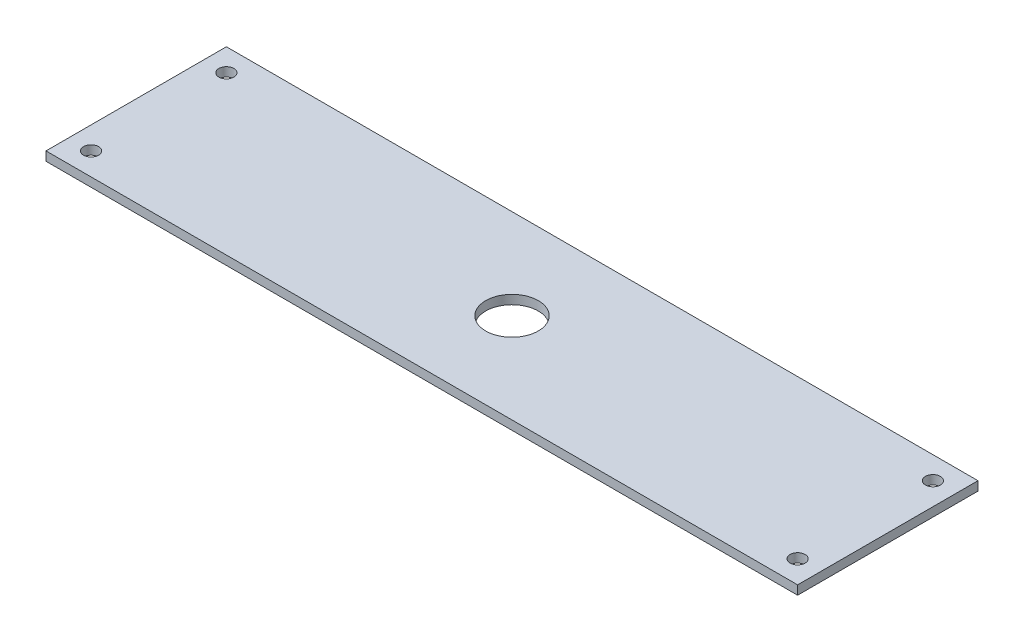
ISO-10303-21;
HEADER;
FILE_DESCRIPTION(('STEP AP214'),'2;1');
FILE_NAME('part.step','',(''),(''),'','','');
FILE_SCHEMA(('AUTOMOTIVE_DESIGN { 1 0 10303 214 1 1 1 1 }'));
ENDSEC;
DATA;
#1=APPLICATION_CONTEXT('core data for automotive mechanical design processes');
#2=APPLICATION_PROTOCOL_DEFINITION('international standard','automotive_design',2000,#1);
#3=PRODUCT_CONTEXT('',#1,'mechanical');
#4=PRODUCT('Part','Part','',(#3));
#5=PRODUCT_RELATED_PRODUCT_CATEGORY('part','',(#4));
#6=PRODUCT_DEFINITION_FORMATION('','',#4);
#7=PRODUCT_DEFINITION_CONTEXT('part definition',#1,'design');
#8=PRODUCT_DEFINITION('design','',#6,#7);
#9=PRODUCT_DEFINITION_SHAPE('','',#8);
#10=(LENGTH_UNIT() NAMED_UNIT(*) SI_UNIT(.MILLI.,.METRE.));
#11=(NAMED_UNIT(*) PLANE_ANGLE_UNIT() SI_UNIT($,.RADIAN.));
#12=(NAMED_UNIT(*) SI_UNIT($,.STERADIAN.) SOLID_ANGLE_UNIT());
#13=UNCERTAINTY_MEASURE_WITH_UNIT(LENGTH_MEASURE(1.E-05),#10,'distance_accuracy_value','');
#14=(GEOMETRIC_REPRESENTATION_CONTEXT(3) GLOBAL_UNCERTAINTY_ASSIGNED_CONTEXT((#13)) GLOBAL_UNIT_ASSIGNED_CONTEXT((#10,
#11,#12)) REPRESENTATION_CONTEXT('',''));
#15=CARTESIAN_POINT('',(0.,0.,0.));
#16=DIRECTION('',(0.,0.,1.));
#17=DIRECTION('',(1.,0.,0.));
#18=AXIS2_PLACEMENT_3D('',#15,#16,#17);
#19=CARTESIAN_POINT('',(0.,3.,0.));
#20=DIRECTION('',(0.,-1.,0.));
#21=DIRECTION('',(0.,0.,-1.));
#22=AXIS2_PLACEMENT_3D('',#19,#20,#21);
#23=PLANE('',#22);
#24=DIRECTION('',(0.,0.,-1.));
#25=VECTOR('',#24,1.);
#26=CARTESIAN_POINT('',(250.,3.,60.));
#27=LINE('',#26,#25);
#28=CARTESIAN_POINT('',(250.,3.,60.));
#29=VERTEX_POINT('',#28);
#30=CARTESIAN_POINT('',(250.,3.,-60.));
#31=VERTEX_POINT('',#30);
#32=EDGE_CURVE('E80',#29,#31,#27,.T.);
#33=ORIENTED_EDGE('',*,*,#32,.T.);
#34=DIRECTION('',(-1.,0.,0.));
#35=VECTOR('',#34,1.);
#36=CARTESIAN_POINT('',(-250.,3.,-60.));
#37=LINE('',#36,#35);
#38=CARTESIAN_POINT('',(-250.,3.,-60.));
#39=VERTEX_POINT('',#38);
#40=EDGE_CURVE('E75',#31,#39,#37,.T.);
#41=ORIENTED_EDGE('',*,*,#40,.T.);
#42=DIRECTION('',(0.,0.,1.));
#43=VECTOR('',#42,1.);
#44=CARTESIAN_POINT('',(-250.,3.,60.));
#45=LINE('',#44,#43);
#46=CARTESIAN_POINT('',(-250.,3.,60.));
#47=VERTEX_POINT('',#46);
#48=EDGE_CURVE('E78',#39,#47,#45,.T.);
#49=ORIENTED_EDGE('',*,*,#48,.T.);
#50=DIRECTION('',(1.,0.,0.));
#51=VECTOR('',#50,1.);
#52=CARTESIAN_POINT('',(-250.,3.,60.));
#53=LINE('',#52,#51);
#54=EDGE_CURVE('E45',#47,#29,#53,.T.);
#55=ORIENTED_EDGE('',*,*,#54,.T.);
#56=EDGE_LOOP('',(#33,#41,#49,#55));
#57=FACE_BOUND('',#56,.T.);
#58=CARTESIAN_POINT('',(0.,3.,0.));
#59=DIRECTION('',(0.,1.,0.));
#60=DIRECTION('',(0.,0.,1.));
#61=AXIS2_PLACEMENT_3D('',#58,#59,#60);
#62=CIRCLE('',#61,17.5);
#63=CARTESIAN_POINT('',(0.,3.,17.5));
#64=VERTEX_POINT('',#63);
#65=EDGE_CURVE('E95',#64,#64,#62,.T.);
#66=ORIENTED_EDGE('',*,*,#65,.F.);
#67=EDGE_LOOP('',(#66));
#68=FACE_BOUND('',#67,.T.);
#69=CARTESIAN_POINT('',(-235.,3.,-45.));
#70=DIRECTION('',(0.,1.,0.));
#71=DIRECTION('',(0.,0.,1.));
#72=AXIS2_PLACEMENT_3D('',#69,#70,#71);
#73=CIRCLE('',#72,4.99999999999999);
#74=CARTESIAN_POINT('',(-235.,3.,-40.));
#75=VERTEX_POINT('',#74);
#76=EDGE_CURVE('E110',#75,#75,#73,.T.);
#77=ORIENTED_EDGE('',*,*,#76,.F.);
#78=EDGE_LOOP('',(#77));
#79=FACE_BOUND('',#78,.T.);
#80=CARTESIAN_POINT('',(-235.,3.,45.));
#81=DIRECTION('',(0.,1.,0.));
#82=DIRECTION('',(0.,0.,-1.));
#83=AXIS2_PLACEMENT_3D('',#80,#81,#82);
#84=CIRCLE('',#83,4.99999999999999);
#85=CARTESIAN_POINT('',(-235.,3.,40.));
#86=VERTEX_POINT('',#85);
#87=EDGE_CURVE('E116',#86,#86,#84,.T.);
#88=ORIENTED_EDGE('',*,*,#87,.F.);
#89=EDGE_LOOP('',(#88));
#90=FACE_BOUND('',#89,.T.);
#91=CARTESIAN_POINT('',(235.,3.,-45.));
#92=DIRECTION('',(0.,1.,0.));
#93=DIRECTION('',(0.,0.,-1.));
#94=AXIS2_PLACEMENT_3D('',#91,#92,#93);
#95=CIRCLE('',#94,4.99999999999999);
#96=CARTESIAN_POINT('',(235.,3.,-50.));
#97=VERTEX_POINT('',#96);
#98=EDGE_CURVE('E122',#97,#97,#95,.T.);
#99=ORIENTED_EDGE('',*,*,#98,.F.);
#100=EDGE_LOOP('',(#99));
#101=FACE_BOUND('',#100,.T.);
#102=CARTESIAN_POINT('',(235.,3.,45.));
#103=DIRECTION('',(0.,1.,0.));
#104=DIRECTION('',(0.,0.,1.));
#105=AXIS2_PLACEMENT_3D('',#102,#103,#104);
#106=CIRCLE('',#105,4.99999999999999);
#107=CARTESIAN_POINT('',(235.,3.,50.));
#108=VERTEX_POINT('',#107);
#109=EDGE_CURVE('E128',#108,#108,#106,.T.);
#110=ORIENTED_EDGE('',*,*,#109,.F.);
#111=EDGE_LOOP('',(#110));
#112=FACE_BOUND('',#111,.T.);
#113=ADVANCED_FACE('F28',(#57,#68,#79,#90,#101,#112),#23,.F.);
#114=CARTESIAN_POINT('',(0.,-3.,0.));
#115=DIRECTION('',(0.,-1.,0.));
#116=DIRECTION('',(0.,0.,-1.));
#117=AXIS2_PLACEMENT_3D('',#114,#115,#116);
#118=PLANE('',#117);
#119=CARTESIAN_POINT('',(235.,-3.,-45.));
#120=DIRECTION('',(0.,1.,0.));
#121=DIRECTION('',(0.,0.,-1.));
#122=AXIS2_PLACEMENT_3D('',#119,#120,#121);
#123=CIRCLE('',#122,4.99999999999999);
#124=CARTESIAN_POINT('',(235.,-3.,-50.));
#125=VERTEX_POINT('',#124);
#126=EDGE_CURVE('E125',#125,#125,#123,.T.);
#127=ORIENTED_EDGE('',*,*,#126,.T.);
#128=EDGE_LOOP('',(#127));
#129=FACE_BOUND('',#128,.T.);
#130=CARTESIAN_POINT('',(-235.,-3.,-45.));
#131=DIRECTION('',(0.,1.,0.));
#132=DIRECTION('',(0.,0.,1.));
#133=AXIS2_PLACEMENT_3D('',#130,#131,#132);
#134=CIRCLE('',#133,4.99999999999999);
#135=CARTESIAN_POINT('',(-235.,-3.,-40.));
#136=VERTEX_POINT('',#135);
#137=EDGE_CURVE('E113',#136,#136,#134,.T.);
#138=ORIENTED_EDGE('',*,*,#137,.T.);
#139=EDGE_LOOP('',(#138));
#140=FACE_BOUND('',#139,.T.);
#141=DIRECTION('',(0.,0.,-1.));
#142=VECTOR('',#141,1.);
#143=CARTESIAN_POINT('',(250.,-3.,60.));
#144=LINE('',#143,#142);
#145=CARTESIAN_POINT('',(250.,-3.,60.));
#146=VERTEX_POINT('',#145);
#147=CARTESIAN_POINT('',(250.,-3.,-60.));
#148=VERTEX_POINT('',#147);
#149=EDGE_CURVE('E92',#146,#148,#144,.T.);
#150=ORIENTED_EDGE('',*,*,#149,.F.);
#151=DIRECTION('',(1.,0.,0.));
#152=VECTOR('',#151,1.);
#153=CARTESIAN_POINT('',(-250.,-3.,60.));
#154=LINE('',#153,#152);
#155=CARTESIAN_POINT('',(-250.,-3.,60.));
#156=VERTEX_POINT('',#155);
#157=EDGE_CURVE('E68',#156,#146,#154,.T.);
#158=ORIENTED_EDGE('',*,*,#157,.F.);
#159=DIRECTION('',(0.,0.,1.));
#160=VECTOR('',#159,1.);
#161=CARTESIAN_POINT('',(-250.,-3.,60.));
#162=LINE('',#161,#160);
#163=CARTESIAN_POINT('',(-250.,-3.,-60.));
#164=VERTEX_POINT('',#163);
#165=EDGE_CURVE('E62',#164,#156,#162,.T.);
#166=ORIENTED_EDGE('',*,*,#165,.F.);
#167=DIRECTION('',(-1.,0.,0.));
#168=VECTOR('',#167,1.);
#169=CARTESIAN_POINT('',(-250.,-3.,-60.));
#170=LINE('',#169,#168);
#171=EDGE_CURVE('E84',#148,#164,#170,.T.);
#172=ORIENTED_EDGE('',*,*,#171,.F.);
#173=EDGE_LOOP('',(#150,#158,#166,#172));
#174=FACE_BOUND('',#173,.T.);
#175=CARTESIAN_POINT('',(0.,-3.,0.));
#176=DIRECTION('',(0.,1.,0.));
#177=DIRECTION('',(0.,0.,1.));
#178=AXIS2_PLACEMENT_3D('',#175,#176,#177);
#179=CIRCLE('',#178,17.5);
#180=CARTESIAN_POINT('',(0.,-3.,17.5));
#181=VERTEX_POINT('',#180);
#182=EDGE_CURVE('E107',#181,#181,#179,.T.);
#183=ORIENTED_EDGE('',*,*,#182,.T.);
#184=EDGE_LOOP('',(#183));
#185=FACE_BOUND('',#184,.T.);
#186=CARTESIAN_POINT('',(-235.,-3.,45.));
#187=DIRECTION('',(0.,1.,0.));
#188=DIRECTION('',(0.,0.,-1.));
#189=AXIS2_PLACEMENT_3D('',#186,#187,#188);
#190=CIRCLE('',#189,4.99999999999999);
#191=CARTESIAN_POINT('',(-235.,-3.,40.));
#192=VERTEX_POINT('',#191);
#193=EDGE_CURVE('E119',#192,#192,#190,.T.);
#194=ORIENTED_EDGE('',*,*,#193,.T.);
#195=EDGE_LOOP('',(#194));
#196=FACE_BOUND('',#195,.T.);
#197=CARTESIAN_POINT('',(235.,-3.,45.));
#198=DIRECTION('',(0.,1.,0.));
#199=DIRECTION('',(0.,0.,1.));
#200=AXIS2_PLACEMENT_3D('',#197,#198,#199);
#201=CIRCLE('',#200,4.99999999999999);
#202=CARTESIAN_POINT('',(235.,-3.,50.));
#203=VERTEX_POINT('',#202);
#204=EDGE_CURVE('E131',#203,#203,#201,.T.);
#205=ORIENTED_EDGE('',*,*,#204,.T.);
#206=EDGE_LOOP('',(#205));
#207=FACE_BOUND('',#206,.T.);
#208=ADVANCED_FACE('F103',(#129,#140,#174,#185,#196,#207),#118,.T.);
#209=CARTESIAN_POINT('',(250.,3.,60.));
#210=DIRECTION('',(-1.,0.,0.));
#211=DIRECTION('',(0.,0.,1.));
#212=AXIS2_PLACEMENT_3D('',#209,#210,#211);
#213=PLANE('',#212);
#214=ORIENTED_EDGE('',*,*,#149,.T.);
#215=DIRECTION('',(0.,-1.,0.));
#216=VECTOR('',#215,1.);
#217=CARTESIAN_POINT('',(250.,3.,-60.));
#218=LINE('',#217,#216);
#219=EDGE_CURVE('E11',#31,#148,#218,.T.);
#220=ORIENTED_EDGE('',*,*,#219,.F.);
#221=ORIENTED_EDGE('',*,*,#32,.F.);
#222=DIRECTION('',(0.,-1.,0.));
#223=VECTOR('',#222,1.);
#224=CARTESIAN_POINT('',(250.,3.,60.));
#225=LINE('',#224,#223);
#226=EDGE_CURVE('E88',#29,#146,#225,.T.);
#227=ORIENTED_EDGE('',*,*,#226,.T.);
#228=EDGE_LOOP('',(#214,#220,#221,#227));
#229=FACE_BOUND('',#228,.T.);
#230=ADVANCED_FACE('F30',(#229),#213,.F.);
#231=CARTESIAN_POINT('',(-250.,3.,-60.));
#232=DIRECTION('',(0.,0.,1.));
#233=DIRECTION('',(1.,0.,0.));
#234=AXIS2_PLACEMENT_3D('',#231,#232,#233);
#235=PLANE('',#234);
#236=ORIENTED_EDGE('',*,*,#171,.T.);
#237=DIRECTION('',(0.,-1.,0.));
#238=VECTOR('',#237,1.);
#239=CARTESIAN_POINT('',(-250.,3.,-60.));
#240=LINE('',#239,#238);
#241=EDGE_CURVE('E37',#39,#164,#240,.T.);
#242=ORIENTED_EDGE('',*,*,#241,.F.);
#243=ORIENTED_EDGE('',*,*,#40,.F.);
#244=ORIENTED_EDGE('',*,*,#219,.T.);
#245=EDGE_LOOP('',(#236,#242,#243,#244));
#246=FACE_BOUND('',#245,.T.);
#247=ADVANCED_FACE('F83',(#246),#235,.F.);
#248=CARTESIAN_POINT('',(-250.,3.,60.));
#249=DIRECTION('',(1.,0.,0.));
#250=DIRECTION('',(0.,0.,-1.));
#251=AXIS2_PLACEMENT_3D('',#248,#249,#250);
#252=PLANE('',#251);
#253=ORIENTED_EDGE('',*,*,#165,.T.);
#254=DIRECTION('',(0.,-1.,0.));
#255=VECTOR('',#254,1.);
#256=CARTESIAN_POINT('',(-250.,3.,60.));
#257=LINE('',#256,#255);
#258=EDGE_CURVE('E85',#47,#156,#257,.T.);
#259=ORIENTED_EDGE('',*,*,#258,.F.);
#260=ORIENTED_EDGE('',*,*,#48,.F.);
#261=ORIENTED_EDGE('',*,*,#241,.T.);
#262=EDGE_LOOP('',(#253,#259,#260,#261));
#263=FACE_BOUND('',#262,.T.);
#264=ADVANCED_FACE('F86',(#263),#252,.F.);
#265=CARTESIAN_POINT('',(-250.,3.,60.));
#266=DIRECTION('',(0.,0.,-1.));
#267=DIRECTION('',(-1.,0.,0.));
#268=AXIS2_PLACEMENT_3D('',#265,#266,#267);
#269=PLANE('',#268);
#270=ORIENTED_EDGE('',*,*,#157,.T.);
#271=ORIENTED_EDGE('',*,*,#226,.F.);
#272=ORIENTED_EDGE('',*,*,#54,.F.);
#273=ORIENTED_EDGE('',*,*,#258,.T.);
#274=EDGE_LOOP('',(#270,#271,#272,#273));
#275=FACE_BOUND('',#274,.T.);
#276=ADVANCED_FACE('F100',(#275),#269,.F.);
#277=CARTESIAN_POINT('',(0.,3.,0.));
#278=DIRECTION('',(0.,-1.,0.));
#279=DIRECTION('',(0.,0.,-1.));
#280=AXIS2_PLACEMENT_3D('',#277,#278,#279);
#281=CYLINDRICAL_SURFACE('',#280,17.5);
#282=ORIENTED_EDGE('',*,*,#65,.T.);
#283=EDGE_LOOP('',(#282));
#284=FACE_BOUND('',#283,.T.);
#285=ORIENTED_EDGE('',*,*,#182,.F.);
#286=EDGE_LOOP('',(#285));
#287=FACE_BOUND('',#286,.T.);
#288=ADVANCED_FACE('F148',(#284,#287),#281,.F.);
#289=CARTESIAN_POINT('',(-235.,3.,-45.));
#290=DIRECTION('',(0.,-1.,0.));
#291=DIRECTION('',(0.,0.,-1.));
#292=AXIS2_PLACEMENT_3D('',#289,#290,#291);
#293=CYLINDRICAL_SURFACE('',#292,4.99999999999999);
#294=ORIENTED_EDGE('',*,*,#76,.T.);
#295=EDGE_LOOP('',(#294));
#296=FACE_BOUND('',#295,.T.);
#297=ORIENTED_EDGE('',*,*,#137,.F.);
#298=EDGE_LOOP('',(#297));
#299=FACE_BOUND('',#298,.T.);
#300=ADVANCED_FACE('F183',(#296,#299),#293,.F.);
#301=CARTESIAN_POINT('',(-235.,3.,45.));
#302=DIRECTION('',(0.,-1.,0.));
#303=DIRECTION('',(0.,0.,-1.));
#304=AXIS2_PLACEMENT_3D('',#301,#302,#303);
#305=CYLINDRICAL_SURFACE('',#304,4.99999999999999);
#306=ORIENTED_EDGE('',*,*,#87,.T.);
#307=EDGE_LOOP('',(#306));
#308=FACE_BOUND('',#307,.T.);
#309=ORIENTED_EDGE('',*,*,#193,.F.);
#310=EDGE_LOOP('',(#309));
#311=FACE_BOUND('',#310,.T.);
#312=ADVANCED_FACE('F190',(#308,#311),#305,.F.);
#313=CARTESIAN_POINT('',(235.,3.,-45.));
#314=DIRECTION('',(0.,-1.,0.));
#315=DIRECTION('',(0.,0.,-1.));
#316=AXIS2_PLACEMENT_3D('',#313,#314,#315);
#317=CYLINDRICAL_SURFACE('',#316,4.99999999999999);
#318=ORIENTED_EDGE('',*,*,#98,.T.);
#319=EDGE_LOOP('',(#318));
#320=FACE_BOUND('',#319,.T.);
#321=ORIENTED_EDGE('',*,*,#126,.F.);
#322=EDGE_LOOP('',(#321));
#323=FACE_BOUND('',#322,.T.);
#324=ADVANCED_FACE('F197',(#320,#323),#317,.F.);
#325=CARTESIAN_POINT('',(235.,3.,45.));
#326=DIRECTION('',(0.,-1.,0.));
#327=DIRECTION('',(0.,0.,-1.));
#328=AXIS2_PLACEMENT_3D('',#325,#326,#327);
#329=CYLINDRICAL_SURFACE('',#328,4.99999999999999);
#330=ORIENTED_EDGE('',*,*,#109,.T.);
#331=EDGE_LOOP('',(#330));
#332=FACE_BOUND('',#331,.T.);
#333=ORIENTED_EDGE('',*,*,#204,.F.);
#334=EDGE_LOOP('',(#333));
#335=FACE_BOUND('',#334,.T.);
#336=ADVANCED_FACE('F137',(#332,#335),#329,.F.);
#337=CLOSED_SHELL('',(#113,#208,#230,#247,#264,#276,#288,#300,#312,#324,#336));
#338=MANIFOLD_SOLID_BREP('B2',#337);
#339=ADVANCED_BREP_SHAPE_REPRESENTATION('',(#18,#338),#14);
#340=SHAPE_DEFINITION_REPRESENTATION(#9,#339);
ENDSEC;
END-ISO-10303-21;
